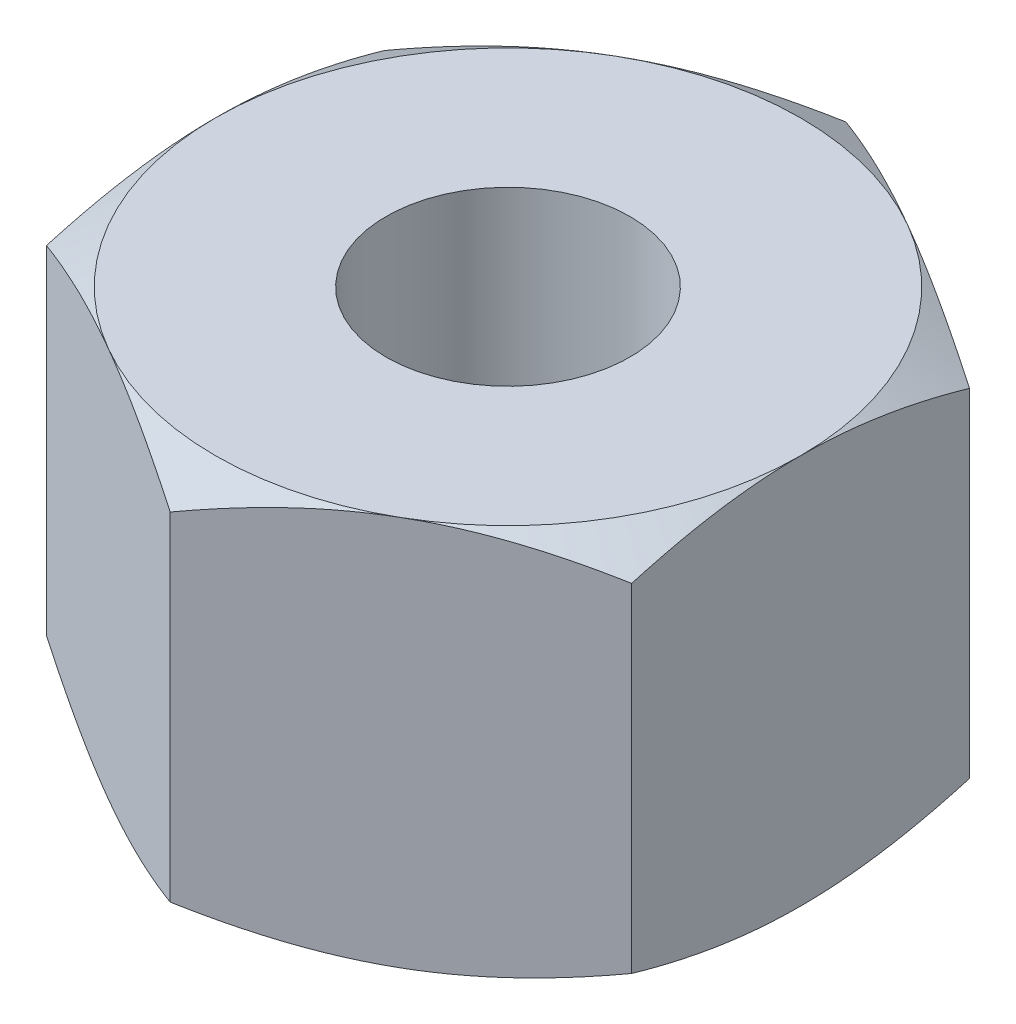
ISO-10303-21;
HEADER;
FILE_DESCRIPTION(('STEP AP214'),'2;1');
FILE_NAME('part.step','',(''),(''),'','','');
FILE_SCHEMA(('AUTOMOTIVE_DESIGN { 1 0 10303 214 1 1 1 1 }'));
ENDSEC;
DATA;
#1=APPLICATION_CONTEXT('core data for automotive mechanical design processes');
#2=APPLICATION_PROTOCOL_DEFINITION('international standard','automotive_design',2000,#1);
#3=PRODUCT_CONTEXT('',#1,'mechanical');
#4=PRODUCT('Part','Part','',(#3));
#5=PRODUCT_RELATED_PRODUCT_CATEGORY('part','',(#4));
#6=PRODUCT_DEFINITION_FORMATION('','',#4);
#7=PRODUCT_DEFINITION_CONTEXT('part definition',#1,'design');
#8=PRODUCT_DEFINITION('design','',#6,#7);
#9=PRODUCT_DEFINITION_SHAPE('','',#8);
#10=(LENGTH_UNIT() NAMED_UNIT(*) SI_UNIT(.MILLI.,.METRE.));
#11=(NAMED_UNIT(*) PLANE_ANGLE_UNIT() SI_UNIT($,.RADIAN.));
#12=(NAMED_UNIT(*) SI_UNIT($,.STERADIAN.) SOLID_ANGLE_UNIT());
#13=UNCERTAINTY_MEASURE_WITH_UNIT(LENGTH_MEASURE(1.E-05),#10,'distance_accuracy_value','');
#14=(GEOMETRIC_REPRESENTATION_CONTEXT(3) GLOBAL_UNCERTAINTY_ASSIGNED_CONTEXT((#13)) GLOBAL_UNIT_ASSIGNED_CONTEXT((#10,
#11,#12)) REPRESENTATION_CONTEXT('',''));
#15=CARTESIAN_POINT('',(0.,0.,0.));
#16=DIRECTION('',(0.,0.,1.));
#17=DIRECTION('',(1.,0.,0.));
#18=AXIS2_PLACEMENT_3D('',#15,#16,#17);
#19=CARTESIAN_POINT('',(1.5,2.,-0.86602540378444));
#20=DIRECTION('',(-0.5,0.,0.866025403784439));
#21=DIRECTION('',(0.866025403784439,0.,0.5));
#22=AXIS2_PLACEMENT_3D('',#19,#20,#21);
#23=PLANE('',#22);
#24=CARTESIAN_POINT('',(-0.000200000000000435,0.134041269548449,-1.73216627762271));
#25=CARTESIAN_POINT('',(0.0657192911025472,0.112057452769177,-1.69410775715987));
#26=CARTESIAN_POINT('',(0.132207589122234,0.0920634856818216,-1.65572072040024));
#27=CARTESIAN_POINT('',(0.26633566066507,0.057162697184506,-1.5782818421891));
#28=CARTESIAN_POINT('',(0.333977818646886,0.0422682243231661,-1.53922862406973));
#29=CARTESIAN_POINT('',(0.468423777869843,0.0190812773102424,-1.4616062133209));
#30=CARTESIAN_POINT('',(0.535206884927247,0.0106345077118139,-1.42304896848399));
#31=CARTESIAN_POINT('',(0.66908756838988,0.000548173511852322,-1.34575291984755));
#32=CARTESIAN_POINT('',(0.736184657704378,-0.00109974064210989,-1.30701439726998));
#33=CARTESIAN_POINT('',(0.861574731829195,0.0023162190531039,-1.23462040422031));
#34=CARTESIAN_POINT('',(0.919886423219819,0.00654135522397954,-1.20095413349903));
#35=CARTESIAN_POINT('',(1.03612987953878,0.0199363714326705,-1.13384094270175));
#36=CARTESIAN_POINT('',(1.09406124196878,0.0291108336158475,-1.10039425500826));
#37=CARTESIAN_POINT('',(1.21054465133915,0.0520477799549937,-1.03314252725216));
#38=CARTESIAN_POINT('',(1.26908194454669,0.0659075581614449,-0.999346005261152));
#39=CARTESIAN_POINT('',(1.38528312338636,0.0973643802366543,-0.932257223377918));
#40=CARTESIAN_POINT('',(1.44294849940381,0.114954025889614,-0.898964103011322));
#41=CARTESIAN_POINT('',(1.5002,0.134041269548449,-0.865909933730602));
#42=B_SPLINE_CURVE_WITH_KNOTS('',3,(#24,#25,#26,#27,#28,#29,#30,#31,#32,#33,#34,#35,#36,#37,#38,
#39,#40,#41),.UNSPECIFIED.,.F.,.F.,(4,2,2,2,2,2,2,2,4),(0.,0.237777822177383,0.476127422841919,
0.70857706723059,0.94074115925158,1.1429435283589,1.34533342091875,1.55221450553907,
1.75868901573748),.UNSPECIFIED.);
#43=CARTESIAN_POINT('',(0.,0.13397459621556,-1.73205080756888));
#44=VERTEX_POINT('',#43);
#45=CARTESIAN_POINT('',(0.75,0.,-1.29903810567666));
#46=VERTEX_POINT('',#45);
#47=EDGE_CURVE('E53',#44,#46,#42,.T.);
#48=ORIENTED_EDGE('',*,*,#47,.F.);
#49=DIRECTION('',(0.,-1.,0.));
#50=VECTOR('',#49,1.);
#51=CARTESIAN_POINT('',(0.,2.,-1.73205080756888));
#52=LINE('',#51,#50);
#53=CARTESIAN_POINT('',(0.,1.86602540378444,-1.73205080756888));
#54=VERTEX_POINT('',#53);
#55=EDGE_CURVE('E279',#54,#44,#52,.T.);
#56=ORIENTED_EDGE('',*,*,#55,.F.);
#57=CARTESIAN_POINT('',(1.5002,1.86595873045155,-0.865909933730602));
#58=CARTESIAN_POINT('',(1.43428070889745,1.88794254723082,-0.903968454193447));
#59=CARTESIAN_POINT('',(1.36779241087776,1.90793651431818,-0.942355490953073));
#60=CARTESIAN_POINT('',(1.23366433933493,1.94283730281549,-1.01979436916421));
#61=CARTESIAN_POINT('',(1.16602218135311,1.95773177567683,-1.05884758728358));
#62=CARTESIAN_POINT('',(1.03157622213016,1.98091872268976,-1.13646999803241));
#63=CARTESIAN_POINT('',(0.964793115072751,1.98936549228819,-1.17502724286933));
#64=CARTESIAN_POINT('',(0.830912431610118,1.99945182648815,-1.25232329150577));
#65=CARTESIAN_POINT('',(0.76381534229562,2.00109974064211,-1.29106181408333));
#66=CARTESIAN_POINT('',(0.638425268170803,1.9976837809469,-1.363455807133));
#67=CARTESIAN_POINT('',(0.580113576780179,1.99345864477602,-1.39712207785428));
#68=CARTESIAN_POINT('',(0.463870120461216,1.98006362856733,-1.46423526865157));
#69=CARTESIAN_POINT('',(0.405938758031213,1.97088916638415,-1.49768195634505));
#70=CARTESIAN_POINT('',(0.289455348660847,1.94795222004501,-1.56493368410116));
#71=CARTESIAN_POINT('',(0.230918055453307,1.93409244183855,-1.59873020609216));
#72=CARTESIAN_POINT('',(0.114716876613639,1.90263561976335,-1.6658189879754));
#73=CARTESIAN_POINT('',(0.0570515005961887,1.88504597411039,-1.69911210834199));
#74=CARTESIAN_POINT('',(-0.000200000000000495,1.86595873045155,-1.73216627762271));
#75=B_SPLINE_CURVE_WITH_KNOTS('',3,(#57,#58,#59,#60,#61,#62,#63,#64,#65,#66,#67,#68,#69,#70,#71,
#72,#73,#74),.UNSPECIFIED.,.F.,.F.,(4,2,2,2,2,2,2,2,4),(0.,0.237777822177383,0.476127422841918,
0.708577067230589,0.940741159251579,1.1429435283589,1.34533342091875,1.55221450553907,
1.75868901573748),.UNSPECIFIED.);
#76=CARTESIAN_POINT('',(0.749999999999999,2.,-1.29903810567666));
#77=VERTEX_POINT('',#76);
#78=EDGE_CURVE('E251',#77,#54,#75,.T.);
#79=ORIENTED_EDGE('',*,*,#78,.F.);
#80=CARTESIAN_POINT('',(1.5,1.86602540378444,-0.86602540378444));
#81=VERTEX_POINT('',#80);
#82=EDGE_CURVE('E319',#81,#77,#75,.T.);
#83=ORIENTED_EDGE('',*,*,#82,.F.);
#84=DIRECTION('',(0.,-1.,0.));
#85=VECTOR('',#84,1.);
#86=CARTESIAN_POINT('',(1.5,2.,-0.86602540378444));
#87=LINE('',#86,#85);
#88=CARTESIAN_POINT('',(1.5,0.13397459621556,-0.86602540378444));
#89=VERTEX_POINT('',#88);
#90=EDGE_CURVE('E321',#81,#89,#87,.T.);
#91=ORIENTED_EDGE('',*,*,#90,.T.);
#92=EDGE_CURVE('E138',#46,#89,#42,.T.);
#93=ORIENTED_EDGE('',*,*,#92,.F.);
#94=EDGE_LOOP('',(#48,#56,#79,#83,#91,#93));
#95=FACE_BOUND('',#94,.T.);
#96=ADVANCED_FACE('F37',(#95),#23,.F.);
#97=CARTESIAN_POINT('',(0.,2.,-1.73205080756888));
#98=DIRECTION('',(0.5,0.,0.866025403784439));
#99=DIRECTION('',(0.866025403784438,0.,-0.5));
#100=AXIS2_PLACEMENT_3D('',#97,#98,#99);
#101=PLANE('',#100);
#102=CARTESIAN_POINT('',(-1.5002,0.134041269548449,-0.8659099337306));
#103=CARTESIAN_POINT('',(-1.43428070889745,0.112057452769177,-0.903968454193445));
#104=CARTESIAN_POINT('',(-1.36779241087776,0.0920634856818216,-0.942355490953072));
#105=CARTESIAN_POINT('',(-1.23366433933493,0.0571626971845059,-1.01979436916421));
#106=CARTESIAN_POINT('',(-1.16602218135311,0.0422682243231661,-1.05884758728358));
#107=CARTESIAN_POINT('',(-1.03157622213016,0.0190812773102424,-1.13646999803241));
#108=CARTESIAN_POINT('',(-0.964793115072752,0.0106345077118139,-1.17502724286933));
#109=CARTESIAN_POINT('',(-0.83091243161012,0.000548173511852331,-1.25232329150577));
#110=CARTESIAN_POINT('',(-0.763815342295622,-0.00109974064210983,-1.29106181408333));
#111=CARTESIAN_POINT('',(-0.638425268170805,0.00231621905310397,-1.363455807133));
#112=CARTESIAN_POINT('',(-0.580113576780181,0.00654135522397959,-1.39712207785428));
#113=CARTESIAN_POINT('',(-0.463870120461218,0.0199363714326705,-1.46423526865157));
#114=CARTESIAN_POINT('',(-0.405938758031215,0.0291108336158474,-1.49768195634505));
#115=CARTESIAN_POINT('',(-0.289455348660848,0.0520477799549937,-1.56493368410116));
#116=CARTESIAN_POINT('',(-0.230918055453309,0.0659075581614451,-1.59873020609216));
#117=CARTESIAN_POINT('',(-0.114716876613641,0.0973643802366547,-1.6658189879754));
#118=CARTESIAN_POINT('',(-0.05705150059619,0.114954025889614,-1.69911210834199));
#119=CARTESIAN_POINT('',(0.000199999999999477,0.134041269548449,-1.73216627762271));
#120=B_SPLINE_CURVE_WITH_KNOTS('',3,(#102,#103,#104,#105,#106,#107,#108,#109,#110,#111,#112,
#113,#114,#115,#116,#117,#118,#119),.UNSPECIFIED.,.F.,.F.,(4,2,2,2,2,2,2,2,4),(0.,
0.237777822177383,0.476127422841919,0.70857706723059,0.94074115925158,1.1429435283589,
1.34533342091875,1.55221450553907,1.75868901573748),.UNSPECIFIED.);
#121=CARTESIAN_POINT('',(-1.5,0.13397459621556,-0.866025403784438));
#122=VERTEX_POINT('',#121);
#123=CARTESIAN_POINT('',(-0.75,0.,-1.29903810567666));
#124=VERTEX_POINT('',#123);
#125=EDGE_CURVE('E61',#122,#124,#120,.T.);
#126=ORIENTED_EDGE('',*,*,#125,.F.);
#127=DIRECTION('',(0.,-1.,0.));
#128=VECTOR('',#127,1.);
#129=CARTESIAN_POINT('',(-1.5,2.,-0.866025403784438));
#130=LINE('',#129,#128);
#131=CARTESIAN_POINT('',(-1.5,1.86602540378444,-0.866025403784438));
#132=VERTEX_POINT('',#131);
#133=EDGE_CURVE('E272',#132,#122,#130,.T.);
#134=ORIENTED_EDGE('',*,*,#133,.F.);
#135=CARTESIAN_POINT('',(0.000199999999999538,1.86595873045155,-1.73216627762271));
#136=CARTESIAN_POINT('',(-0.065719291102548,1.88794254723082,-1.69410775715987));
#137=CARTESIAN_POINT('',(-0.132207589122235,1.90793651431818,-1.65572072040024));
#138=CARTESIAN_POINT('',(-0.26633566066507,1.94283730281549,-1.5782818421891));
#139=CARTESIAN_POINT('',(-0.333977818646886,1.95773177567683,-1.53922862406973));
#140=CARTESIAN_POINT('',(-0.468423777869843,1.98091872268976,-1.4616062133209));
#141=CARTESIAN_POINT('',(-0.535206884927248,1.98936549228819,-1.42304896848399));
#142=CARTESIAN_POINT('',(-0.669087568389881,1.99945182648815,-1.34575291984755));
#143=CARTESIAN_POINT('',(-0.736184657704379,2.00109974064211,-1.30701439726998));
#144=CARTESIAN_POINT('',(-0.861574731829195,1.9976837809469,-1.23462040422031));
#145=CARTESIAN_POINT('',(-0.919886423219819,1.99345864477602,-1.20095413349903));
#146=CARTESIAN_POINT('',(-1.03612987953878,1.98006362856733,-1.13384094270175));
#147=CARTESIAN_POINT('',(-1.09406124196879,1.97088916638415,-1.10039425500826));
#148=CARTESIAN_POINT('',(-1.21054465133915,1.94795222004501,-1.03314252725216));
#149=CARTESIAN_POINT('',(-1.26908194454669,1.93409244183855,-0.999346005261151));
#150=CARTESIAN_POINT('',(-1.38528312338636,1.90263561976335,-0.932257223377916));
#151=CARTESIAN_POINT('',(-1.44294849940381,1.88504597411039,-0.89896410301132));
#152=CARTESIAN_POINT('',(-1.5002,1.86595873045155,-0.8659099337306));
#153=B_SPLINE_CURVE_WITH_KNOTS('',3,(#135,#136,#137,#138,#139,#140,#141,#142,#143,#144,#145,
#146,#147,#148,#149,#150,#151,#152),.UNSPECIFIED.,.F.,.F.,(4,2,2,2,2,2,2,2,4),(0.,
0.237777822177383,0.476127422841919,0.70857706723059,0.94074115925158,1.1429435283589,
1.34533342091875,1.55221450553907,1.75868901573748),.UNSPECIFIED.);
#154=CARTESIAN_POINT('',(-0.75,2.,-1.29903810567666));
#155=VERTEX_POINT('',#154);
#156=EDGE_CURVE('E244',#155,#132,#153,.T.);
#157=ORIENTED_EDGE('',*,*,#156,.F.);
#158=EDGE_CURVE('E250',#54,#155,#153,.T.);
#159=ORIENTED_EDGE('',*,*,#158,.F.);
#160=ORIENTED_EDGE('',*,*,#55,.T.);
#161=EDGE_CURVE('E161',#124,#44,#120,.T.);
#162=ORIENTED_EDGE('',*,*,#161,.F.);
#163=EDGE_LOOP('',(#126,#134,#157,#159,#160,#162));
#164=FACE_BOUND('',#163,.T.);
#165=ADVANCED_FACE('F257',(#164),#101,.F.);
#166=CARTESIAN_POINT('',(-1.5,2.,-0.866025403784438));
#167=DIRECTION('',(1.,0.,0.));
#168=DIRECTION('',(0.,0.,-1.));
#169=AXIS2_PLACEMENT_3D('',#166,#167,#168);
#170=PLANE('',#169);
#171=CARTESIAN_POINT('',(-1.5,1.23935326559912,3.32383182855059));
#172=CARTESIAN_POINT('',(-1.5,1.19931072203002,3.24773444081221));
#173=CARTESIAN_POINT('',(-1.5,1.15944483419007,3.17154359329883));
#174=CARTESIAN_POINT('',(-1.5,1.08015344998119,3.01893211735204));
#175=CARTESIAN_POINT('',(-1.5,1.0407279585016,2.94251148637947));
#176=CARTESIAN_POINT('',(-1.5,0.923140733543339,2.71264122693784));
#177=CARTESIAN_POINT('',(-1.5,0.845774334636883,2.55878373390948));
#178=CARTESIAN_POINT('',(-1.5,0.689886007328986,2.24057476050208));
#179=CARTESIAN_POINT('',(-1.5,0.611553856504214,2.07612896534836));
#180=CARTESIAN_POINT('',(-1.5,0.498633815715322,1.82741823782556));
#181=CARTESIAN_POINT('',(-1.5,0.461764449151681,1.74419287639866));
#182=CARTESIAN_POINT('',(-1.5,0.390073652916677,1.57686805200305));
#183=CARTESIAN_POINT('',(-1.5,0.355252050088427,1.4927686636509));
#184=CARTESIAN_POINT('',(-1.5,0.285008495735525,1.31501031190938));
#185=CARTESIAN_POINT('',(-1.5,0.249874575221898,1.22123621362942));
#186=CARTESIAN_POINT('',(-1.5,0.184287701993703,1.0320807610056));
#187=CARTESIAN_POINT('',(-1.5,0.153832802613613,0.936700093487788));
#188=CARTESIAN_POINT('',(-1.5,0.100039738372326,0.746059020269428));
#189=CARTESIAN_POINT('',(-1.5,0.0765660130122355,0.650837846261879));
#190=CARTESIAN_POINT('',(-1.5,0.0380966740241617,0.458690084648549));
#191=CARTESIAN_POINT('',(-1.5,0.0230963320255924,0.361764479360881));
#192=CARTESIAN_POINT('',(-1.5,0.00337847888060209,0.164770618469119));
#193=CARTESIAN_POINT('',(-1.5,-0.00111767148941501,0.0646790110011701));
#194=CARTESIAN_POINT('',(-1.5,0.00159794329697957,-0.135331842199714));
#195=CARTESIAN_POINT('',(-1.5,0.0088093013864336,-0.235251093804494));
#196=CARTESIAN_POINT('',(-1.5,0.0340082058069467,-0.435926448061239));
#197=CARTESIAN_POINT('',(-1.5,0.0522330587510966,-0.536651321222842));
#198=CARTESIAN_POINT('',(-1.5,0.097214063241731,-0.736181517411992));
#199=CARTESIAN_POINT('',(-1.5,0.123976558557891,-0.834985354940177));
#200=CARTESIAN_POINT('',(-1.5,0.186883165276771,-1.04132362943054));
#201=CARTESIAN_POINT('',(-1.5,0.223731149959186,-1.14863854017299));
#202=CARTESIAN_POINT('',(-1.5,0.302553492065502,-1.36138875191757));
#203=CARTESIAN_POINT('',(-1.5,0.344530313552321,-1.4668231213491));
#204=CARTESIAN_POINT('',(-1.5,0.432057731625892,-1.67639285335309));
#205=CARTESIAN_POINT('',(-1.5,0.477614267398377,-1.78052571011326));
#206=CARTESIAN_POINT('',(-1.5,0.571185850553668,-1.98768283112336));
#207=CARTESIAN_POINT('',(-1.5,0.619201093337546,-2.0907070064731));
#208=CARTESIAN_POINT('',(-1.5,0.713627146492178,-2.28884408430459));
#209=CARTESIAN_POINT('',(-1.5,0.759920677438779,-2.38401313856044));
#210=CARTESIAN_POINT('',(-1.5,0.85366156162985,-2.57378692277396));
#211=CARTESIAN_POINT('',(-1.5,0.90110898294307,-2.66839161902783));
#212=CARTESIAN_POINT('',(-1.5,0.996640526958966,-2.85667408411614));
#213=CARTESIAN_POINT('',(-1.5,1.04472019167893,-2.95035412036296));
#214=CARTESIAN_POINT('',(-1.5,1.14156566427049,-3.13734549738905));
#215=CARTESIAN_POINT('',(-1.5,1.19033139277256,-3.23065687924335));
#216=CARTESIAN_POINT('',(-1.5,1.23935326559912,-3.32383182855059));
#217=B_SPLINE_CURVE_WITH_KNOTS('',3,(#171,#172,#173,#174,#175,#176,#177,#178,#179,#180,#181,
#182,#183,#184,#185,#186,#187,#188,#189,#190,#191,#192,#193,#194,#195,#196,#197,#198,#199,#200,
#201,#202,#203,#204,#205,#206,#207,#208,#209,#210,#211,#212,#213,#214,#215,#216),.UNSPECIFIED.,
.F.,.F.,(4,2,2,2,2,2,2,2,2,2,2,2,2,2,2,2,2,2,2,2,2,2,4),(0.,0.257969275327055,0.515941411825195,
1.03256613880967,1.57892532486768,1.85198467157293,2.12502089534906,2.42535429882314,
2.72556241088318,3.019489815213,3.31325303788595,3.61315314686089,3.91304282861206,
4.21963679585738,4.52645910593605,4.86665962067304,5.20702422645939,5.54796597217963,
5.88893485577818,6.20641871472018,6.52392134789196,6.83981132523501,7.15566505352143),.UNSPECIFIED.);
#218=CARTESIAN_POINT('',(-1.5,0.13397459621556,0.866025403784439));
#219=VERTEX_POINT('',#218);
#220=CARTESIAN_POINT('',(-1.5,0.,0.));
#221=VERTEX_POINT('',#220);
#222=EDGE_CURVE('E348',#219,#221,#217,.T.);
#223=ORIENTED_EDGE('',*,*,#222,.F.);
#224=DIRECTION('',(0.,-1.,0.));
#225=VECTOR('',#224,1.);
#226=CARTESIAN_POINT('',(-1.5,2.,0.866025403784439));
#227=LINE('',#226,#225);
#228=CARTESIAN_POINT('',(-1.5,1.86602540378444,0.866025403784439));
#229=VERTEX_POINT('',#228);
#230=EDGE_CURVE('E280',#229,#219,#227,.T.);
#231=ORIENTED_EDGE('',*,*,#230,.F.);
#232=CARTESIAN_POINT('',(-1.5,0.760646734400879,-3.32383182855059));
#233=CARTESIAN_POINT('',(-1.5,0.800689277969975,-3.24773444081221));
#234=CARTESIAN_POINT('',(-1.5,0.840555165809925,-3.17154359329883));
#235=CARTESIAN_POINT('',(-1.5,0.91984655001881,-3.01893211735204));
#236=CARTESIAN_POINT('',(-1.5,0.959272041498401,-2.94251148637947));
#237=CARTESIAN_POINT('',(-1.5,1.07685926645666,-2.71264122693784));
#238=CARTESIAN_POINT('',(-1.5,1.15422566536312,-2.55878373390948));
#239=CARTESIAN_POINT('',(-1.5,1.31011399267101,-2.24057476050208));
#240=CARTESIAN_POINT('',(-1.5,1.38844614349579,-2.07612896534836));
#241=CARTESIAN_POINT('',(-1.5,1.50136618428468,-1.82741823782556));
#242=CARTESIAN_POINT('',(-1.5,1.53823555084832,-1.74419287639866));
#243=CARTESIAN_POINT('',(-1.5,1.60992634708332,-1.57686805200305));
#244=CARTESIAN_POINT('',(-1.5,1.64474794991157,-1.4927686636509));
#245=CARTESIAN_POINT('',(-1.5,1.71499150426447,-1.31501031190938));
#246=CARTESIAN_POINT('',(-1.5,1.7501254247781,-1.22123621362942));
#247=CARTESIAN_POINT('',(-1.5,1.8157122980063,-1.0320807610056));
#248=CARTESIAN_POINT('',(-1.5,1.84616719738639,-0.936700093487788));
#249=CARTESIAN_POINT('',(-1.5,1.89996026162767,-0.746059020269428));
#250=CARTESIAN_POINT('',(-1.5,1.92343398698776,-0.650837846261879));
#251=CARTESIAN_POINT('',(-1.5,1.96190332597584,-0.458690084648549));
#252=CARTESIAN_POINT('',(-1.5,1.97690366797441,-0.36176447936088));
#253=CARTESIAN_POINT('',(-1.5,1.9966215211194,-0.164770618469118));
#254=CARTESIAN_POINT('',(-1.5,2.00111767148941,-0.0646790110011692));
#255=CARTESIAN_POINT('',(-1.5,1.99840205670302,0.135331842199715));
#256=CARTESIAN_POINT('',(-1.5,1.99119069861357,0.235251093804495));
#257=CARTESIAN_POINT('',(-1.5,1.96599179419305,0.43592644806124));
#258=CARTESIAN_POINT('',(-1.5,1.9477669412489,0.536651321222843));
#259=CARTESIAN_POINT('',(-1.5,1.90278593675827,0.736181517411994));
#260=CARTESIAN_POINT('',(-1.5,1.87602344144211,0.834985354940178));
#261=CARTESIAN_POINT('',(-1.5,1.81311683472323,1.04132362943054));
#262=CARTESIAN_POINT('',(-1.5,1.77626885004081,1.14863854017299));
#263=CARTESIAN_POINT('',(-1.5,1.6974465079345,1.36138875191757));
#264=CARTESIAN_POINT('',(-1.5,1.65546968644768,1.46682312134911));
#265=CARTESIAN_POINT('',(-1.5,1.56794226837411,1.6763928533531));
#266=CARTESIAN_POINT('',(-1.5,1.52238573260162,1.78052571011326));
#267=CARTESIAN_POINT('',(-1.5,1.42881414944633,1.98768283112336));
#268=CARTESIAN_POINT('',(-1.5,1.38079890666245,2.0907070064731));
#269=CARTESIAN_POINT('',(-1.5,1.28637285350782,2.28884408430459));
#270=CARTESIAN_POINT('',(-1.5,1.24007932256122,2.38401313856044));
#271=CARTESIAN_POINT('',(-1.5,1.14633843837015,2.57378692277396));
#272=CARTESIAN_POINT('',(-1.5,1.09889101705693,2.66839161902783));
#273=CARTESIAN_POINT('',(-1.5,1.00335947304103,2.85667408411614));
#274=CARTESIAN_POINT('',(-1.5,0.955279808321074,2.95035412036296));
#275=CARTESIAN_POINT('',(-1.5,0.858434335729514,3.13734549738905));
#276=CARTESIAN_POINT('',(-1.5,0.809668607227437,3.23065687924335));
#277=CARTESIAN_POINT('',(-1.5,0.76064673440088,3.32383182855059));
#278=B_SPLINE_CURVE_WITH_KNOTS('',3,(#232,#233,#234,#235,#236,#237,#238,#239,#240,#241,#242,
#243,#244,#245,#246,#247,#248,#249,#250,#251,#252,#253,#254,#255,#256,#257,#258,#259,#260,#261,
#262,#263,#264,#265,#266,#267,#268,#269,#270,#271,#272,#273,#274,#275,#276,#277),.UNSPECIFIED.,
.F.,.F.,(4,2,2,2,2,2,2,2,2,2,2,2,2,2,2,2,2,2,2,2,2,2,4),(0.,0.257969275327055,0.515941411825195,
1.03256613880967,1.57892532486768,1.85198467157293,2.12502089534906,2.42535429882314,
2.72556241088318,3.019489815213,3.31325303788595,3.61315314686089,3.91304282861206,
4.21963679585738,4.52645910593605,4.86665962067304,5.20702422645939,5.54796597217963,
5.88893485577818,6.20641871472017,6.52392134789196,6.83981132523501,7.15566505352143),.UNSPECIFIED.);
#279=CARTESIAN_POINT('',(-1.5,2.,0.));
#280=VERTEX_POINT('',#279);
#281=EDGE_CURVE('E237',#280,#229,#278,.T.);
#282=ORIENTED_EDGE('',*,*,#281,.F.);
#283=EDGE_CURVE('E243',#132,#280,#278,.T.);
#284=ORIENTED_EDGE('',*,*,#283,.F.);
#285=ORIENTED_EDGE('',*,*,#133,.T.);
#286=EDGE_CURVE('E196',#221,#122,#217,.T.);
#287=ORIENTED_EDGE('',*,*,#286,.F.);
#288=EDGE_LOOP('',(#223,#231,#282,#284,#285,#287));
#289=FACE_BOUND('',#288,.T.);
#290=ADVANCED_FACE('F218',(#289),#170,.F.);
#291=CARTESIAN_POINT('',(-1.5,2.,0.866025403784439));
#292=DIRECTION('',(0.5,0.,-0.866025403784439));
#293=DIRECTION('',(-0.866025403784439,0.,-0.5));
#294=AXIS2_PLACEMENT_3D('',#291,#292,#293);
#295=PLANE('',#294);
#296=CARTESIAN_POINT('',(0.000200000000000532,0.134041269548449,1.73216627762271));
#297=CARTESIAN_POINT('',(-0.0657192911025471,0.112057452769177,1.69410775715987));
#298=CARTESIAN_POINT('',(-0.132207589122234,0.0920634856818218,1.65572072040024));
#299=CARTESIAN_POINT('',(-0.266335660665069,0.057162697184506,1.5782818421891));
#300=CARTESIAN_POINT('',(-0.333977818646885,0.0422682243231661,1.53922862406973));
#301=CARTESIAN_POINT('',(-0.468423777869842,0.0190812773102423,1.4616062133209));
#302=CARTESIAN_POINT('',(-0.535206884927247,0.0106345077118138,1.42304896848399));
#303=CARTESIAN_POINT('',(-0.66908756838988,0.000548173511852292,1.34575291984755));
#304=CARTESIAN_POINT('',(-0.736184657704378,-0.00109974064210984,1.30701439726998));
#305=CARTESIAN_POINT('',(-0.861574731829195,0.00231621905310392,1.23462040422031));
#306=CARTESIAN_POINT('',(-0.919886423219819,0.00654135522397948,1.20095413349903));
#307=CARTESIAN_POINT('',(-1.03612987953878,0.0199363714326704,1.13384094270175));
#308=CARTESIAN_POINT('',(-1.09406124196879,0.0291108336158474,1.10039425500826));
#309=CARTESIAN_POINT('',(-1.21054465133915,0.0520477799549938,1.03314252725216));
#310=CARTESIAN_POINT('',(-1.26908194454669,0.065907558161445,0.999346005261151));
#311=CARTESIAN_POINT('',(-1.38528312338636,0.0973643802366546,0.932257223377917));
#312=CARTESIAN_POINT('',(-1.44294849940381,0.114954025889614,0.898964103011321));
#313=CARTESIAN_POINT('',(-1.5002,0.134041269548449,0.865909933730601));
#314=B_SPLINE_CURVE_WITH_KNOTS('',3,(#296,#297,#298,#299,#300,#301,#302,#303,#304,#305,#306,
#307,#308,#309,#310,#311,#312,#313),.UNSPECIFIED.,.F.,.F.,(4,2,2,2,2,2,2,2,4),(0.,
0.237777822177383,0.476127422841918,0.708577067230589,0.94074115925158,1.1429435283589,
1.34533342091875,1.55221450553907,1.75868901573748),.UNSPECIFIED.);
#315=CARTESIAN_POINT('',(0.,0.13397459621556,1.73205080756888));
#316=VERTEX_POINT('',#315);
#317=CARTESIAN_POINT('',(-0.75,0.,1.29903810567666));
#318=VERTEX_POINT('',#317);
#319=EDGE_CURVE('E147',#316,#318,#314,.T.);
#320=ORIENTED_EDGE('',*,*,#319,.F.);
#321=DIRECTION('',(0.,-1.,0.));
#322=VECTOR('',#321,1.);
#323=CARTESIAN_POINT('',(0.,2.,1.73205080756888));
#324=LINE('',#323,#322);
#325=CARTESIAN_POINT('',(0.,1.86602540378444,1.73205080756888));
#326=VERTEX_POINT('',#325);
#327=EDGE_CURVE('E160',#326,#316,#324,.T.);
#328=ORIENTED_EDGE('',*,*,#327,.F.);
#329=CARTESIAN_POINT('',(-1.5002,1.86595873045155,0.865909933730601));
#330=CARTESIAN_POINT('',(-1.43428070889745,1.88794254723082,0.903968454193446));
#331=CARTESIAN_POINT('',(-1.36779241087776,1.90793651431818,0.942355490953072));
#332=CARTESIAN_POINT('',(-1.23366433933493,1.94283730281549,1.01979436916421));
#333=CARTESIAN_POINT('',(-1.16602218135311,1.95773177567683,1.05884758728358));
#334=CARTESIAN_POINT('',(-1.03157622213016,1.98091872268976,1.13646999803241));
#335=CARTESIAN_POINT('',(-0.964793115072751,1.98936549228819,1.17502724286933));
#336=CARTESIAN_POINT('',(-0.830912431610119,1.99945182648815,1.25232329150577));
#337=CARTESIAN_POINT('',(-0.763815342295621,2.00109974064211,1.29106181408333));
#338=CARTESIAN_POINT('',(-0.638425268170804,1.9976837809469,1.363455807133));
#339=CARTESIAN_POINT('',(-0.58011357678018,1.99345864477602,1.39712207785428));
#340=CARTESIAN_POINT('',(-0.463870120461217,1.98006362856733,1.46423526865157));
#341=CARTESIAN_POINT('',(-0.405938758031214,1.97088916638415,1.49768195634505));
#342=CARTESIAN_POINT('',(-0.289455348660847,1.94795222004501,1.56493368410116));
#343=CARTESIAN_POINT('',(-0.230918055453307,1.93409244183855,1.59873020609216));
#344=CARTESIAN_POINT('',(-0.114716876613639,1.90263561976335,1.6658189879754));
#345=CARTESIAN_POINT('',(-0.0570515005961885,1.88504597411039,1.69911210834199));
#346=CARTESIAN_POINT('',(0.000200000000000723,1.86595873045155,1.73216627762271));
#347=B_SPLINE_CURVE_WITH_KNOTS('',3,(#329,#330,#331,#332,#333,#334,#335,#336,#337,#338,#339,
#340,#341,#342,#343,#344,#345,#346),.UNSPECIFIED.,.F.,.F.,(4,2,2,2,2,2,2,2,4),(0.,
0.237777822177383,0.476127422841919,0.70857706723059,0.94074115925158,1.1429435283589,
1.34533342091875,1.55221450553907,1.75868901573748),.UNSPECIFIED.);
#348=CARTESIAN_POINT('',(-0.749999999999999,2.,1.29903810567666));
#349=VERTEX_POINT('',#348);
#350=EDGE_CURVE('E223',#349,#326,#347,.T.);
#351=ORIENTED_EDGE('',*,*,#350,.F.);
#352=EDGE_CURVE('E230',#229,#349,#347,.T.);
#353=ORIENTED_EDGE('',*,*,#352,.F.);
#354=ORIENTED_EDGE('',*,*,#230,.T.);
#355=EDGE_CURVE('E163',#318,#219,#314,.T.);
#356=ORIENTED_EDGE('',*,*,#355,.F.);
#357=EDGE_LOOP('',(#320,#328,#351,#353,#354,#356));
#358=FACE_BOUND('',#357,.T.);
#359=ADVANCED_FACE('F215',(#358),#295,.F.);
#360=CARTESIAN_POINT('',(0.,2.,1.73205080756888));
#361=DIRECTION('',(-0.5,0.,-0.866025403784439));
#362=DIRECTION('',(-0.866025403784439,0.,0.5));
#363=AXIS2_PLACEMENT_3D('',#360,#361,#362);
#364=PLANE('',#363);
#365=CARTESIAN_POINT('',(1.5002,0.134041269548449,0.865909933730602));
#366=CARTESIAN_POINT('',(1.43428070889745,0.112057452769177,0.903968454193447));
#367=CARTESIAN_POINT('',(1.36779241087776,0.0920634856818217,0.942355490953073));
#368=CARTESIAN_POINT('',(1.23366433933493,0.057162697184506,1.01979436916421));
#369=CARTESIAN_POINT('',(1.16602218135311,0.0422682243231661,1.05884758728358));
#370=CARTESIAN_POINT('',(1.03157622213016,0.0190812773102425,1.13646999803241));
#371=CARTESIAN_POINT('',(0.964793115072751,0.0106345077118142,1.17502724286933));
#372=CARTESIAN_POINT('',(0.830912431610119,0.000548173511852633,1.25232329150577));
#373=CARTESIAN_POINT('',(0.763815342295621,-0.00109974064210963,1.29106181408333));
#374=CARTESIAN_POINT('',(0.638425268170804,0.00231621905310414,1.363455807133));
#375=CARTESIAN_POINT('',(0.58011357678018,0.0065413552239798,1.39712207785428));
#376=CARTESIAN_POINT('',(0.463870120461217,0.0199363714326709,1.46423526865157));
#377=CARTESIAN_POINT('',(0.405938758031214,0.0291108336158478,1.49768195634505));
#378=CARTESIAN_POINT('',(0.289455348660848,0.0520477799549941,1.56493368410116));
#379=CARTESIAN_POINT('',(0.230918055453308,0.0659075581614452,1.59873020609216));
#380=CARTESIAN_POINT('',(0.114716876613641,0.0973643802366547,1.6658189879754));
#381=CARTESIAN_POINT('',(0.05705150059619,0.114954025889614,1.69911210834199));
#382=CARTESIAN_POINT('',(-0.000199999999999293,0.134041269548449,1.73216627762271));
#383=B_SPLINE_CURVE_WITH_KNOTS('',3,(#365,#366,#367,#368,#369,#370,#371,#372,#373,#374,#375,
#376,#377,#378,#379,#380,#381,#382),.UNSPECIFIED.,.F.,.F.,(4,2,2,2,2,2,2,2,4),(0.,
0.237777822177383,0.476127422841919,0.70857706723059,0.94074115925158,1.1429435283589,
1.34533342091875,1.55221450553907,1.75868901573748),.UNSPECIFIED.);
#384=CARTESIAN_POINT('',(1.5,0.13397459621556,0.866025403784439));
#385=VERTEX_POINT('',#384);
#386=CARTESIAN_POINT('',(0.75,0.,1.29903810567666));
#387=VERTEX_POINT('',#386);
#388=EDGE_CURVE('E127',#385,#387,#383,.T.);
#389=ORIENTED_EDGE('',*,*,#388,.F.);
#390=DIRECTION('',(0.,-1.,0.));
#391=VECTOR('',#390,1.);
#392=CARTESIAN_POINT('',(1.5,2.,0.866025403784439));
#393=LINE('',#392,#391);
#394=CARTESIAN_POINT('',(1.5,1.86602540378444,0.866025403784439));
#395=VERTEX_POINT('',#394);
#396=EDGE_CURVE('E326',#395,#385,#393,.T.);
#397=ORIENTED_EDGE('',*,*,#396,.F.);
#398=CARTESIAN_POINT('',(-0.000199999999999442,1.86595873045155,1.73216627762271));
#399=CARTESIAN_POINT('',(0.0657192911025482,1.88794254723082,1.69410775715987));
#400=CARTESIAN_POINT('',(0.132207589122235,1.90793651431818,1.65572072040024));
#401=CARTESIAN_POINT('',(0.266335660665071,1.94283730281549,1.5782818421891));
#402=CARTESIAN_POINT('',(0.333977818646887,1.95773177567683,1.53922862406973));
#403=CARTESIAN_POINT('',(0.468423777869844,1.98091872268976,1.4616062133209));
#404=CARTESIAN_POINT('',(0.535206884927248,1.98936549228819,1.42304896848399));
#405=CARTESIAN_POINT('',(0.669087568389881,1.99945182648815,1.34575291984755));
#406=CARTESIAN_POINT('',(0.736184657704379,2.00109974064211,1.30701439726998));
#407=CARTESIAN_POINT('',(0.861574731829196,1.9976837809469,1.23462040422031));
#408=CARTESIAN_POINT('',(0.91988642321982,1.99345864477602,1.20095413349903));
#409=CARTESIAN_POINT('',(1.03612987953878,1.98006362856733,1.13384094270175));
#410=CARTESIAN_POINT('',(1.09406124196879,1.97088916638415,1.10039425500826));
#411=CARTESIAN_POINT('',(1.21054465133915,1.94795222004501,1.03314252725216));
#412=CARTESIAN_POINT('',(1.26908194454669,1.93409244183855,0.999346005261151));
#413=CARTESIAN_POINT('',(1.38528312338636,1.90263561976335,0.932257223377917));
#414=CARTESIAN_POINT('',(1.44294849940381,1.88504597411039,0.898964103011321));
#415=CARTESIAN_POINT('',(1.5002,1.86595873045155,0.865909933730602));
#416=B_SPLINE_CURVE_WITH_KNOTS('',3,(#398,#399,#400,#401,#402,#403,#404,#405,#406,#407,#408,
#409,#410,#411,#412,#413,#414,#415),.UNSPECIFIED.,.F.,.F.,(4,2,2,2,2,2,2,2,4),(0.,
0.237777822177383,0.476127422841919,0.70857706723059,0.94074115925158,1.1429435283589,
1.34533342091875,1.55221450553907,1.75868901573748),.UNSPECIFIED.);
#417=CARTESIAN_POINT('',(0.75,2.,1.29903810567666));
#418=VERTEX_POINT('',#417);
#419=EDGE_CURVE('E232',#418,#395,#416,.T.);
#420=ORIENTED_EDGE('',*,*,#419,.F.);
#421=EDGE_CURVE('E231',#326,#418,#416,.T.);
#422=ORIENTED_EDGE('',*,*,#421,.F.);
#423=ORIENTED_EDGE('',*,*,#327,.T.);
#424=EDGE_CURVE('E141',#387,#316,#383,.T.);
#425=ORIENTED_EDGE('',*,*,#424,.F.);
#426=EDGE_LOOP('',(#389,#397,#420,#422,#423,#425));
#427=FACE_BOUND('',#426,.T.);
#428=ADVANCED_FACE('F157',(#427),#364,.F.);
#429=CARTESIAN_POINT('',(1.5,2.,0.866025403784439));
#430=DIRECTION('',(-1.,0.,0.));
#431=DIRECTION('',(0.,0.,1.));
#432=AXIS2_PLACEMENT_3D('',#429,#430,#431);
#433=PLANE('',#432);
#434=CARTESIAN_POINT('',(1.5,1.23935326559912,-3.32383182855059));
#435=CARTESIAN_POINT('',(1.5,1.19931072203003,-3.24773444081221));
#436=CARTESIAN_POINT('',(1.5,1.15944483419008,-3.17154359329883));
#437=CARTESIAN_POINT('',(1.5,1.08015344998119,-3.01893211735204));
#438=CARTESIAN_POINT('',(1.5,1.0407279585016,-2.94251148637947));
#439=CARTESIAN_POINT('',(1.5,0.923140733543339,-2.71264122693784));
#440=CARTESIAN_POINT('',(1.5,0.845774334636884,-2.55878373390949));
#441=CARTESIAN_POINT('',(1.5,0.689886007328987,-2.24057476050208));
#442=CARTESIAN_POINT('',(1.5,0.611553856504214,-2.07612896534837));
#443=CARTESIAN_POINT('',(1.5,0.498633815715322,-1.82741823782556));
#444=CARTESIAN_POINT('',(1.5,0.461764449151681,-1.74419287639866));
#445=CARTESIAN_POINT('',(1.5,0.390073652916678,-1.57686805200305));
#446=CARTESIAN_POINT('',(1.5,0.355252050088427,-1.4927686636509));
#447=CARTESIAN_POINT('',(1.5,0.285008495735525,-1.31501031190938));
#448=CARTESIAN_POINT('',(1.5,0.249874575221898,-1.22123621362942));
#449=CARTESIAN_POINT('',(1.5,0.184287701993704,-1.0320807610056));
#450=CARTESIAN_POINT('',(1.5,0.153832802613613,-0.936700093487791));
#451=CARTESIAN_POINT('',(1.5,0.100039738372326,-0.746059020269431));
#452=CARTESIAN_POINT('',(1.5,0.0765660130122357,-0.650837846261881));
#453=CARTESIAN_POINT('',(1.5,0.0380966740241616,-0.458690084648551));
#454=CARTESIAN_POINT('',(1.5,0.0230963320255922,-0.361764479360883));
#455=CARTESIAN_POINT('',(1.5,0.0033784788806018,-0.164770618469121));
#456=CARTESIAN_POINT('',(1.5,-0.00111767148941538,-0.0646790110011719));
#457=CARTESIAN_POINT('',(1.5,0.00159794329697907,0.135331842199712));
#458=CARTESIAN_POINT('',(1.5,0.008809301386433,0.235251093804492));
#459=CARTESIAN_POINT('',(1.5,0.0340082058069459,0.435926448061237));
#460=CARTESIAN_POINT('',(1.5,0.0522330587510959,0.53665132122284));
#461=CARTESIAN_POINT('',(1.5,0.0972140632417302,0.736181517411991));
#462=CARTESIAN_POINT('',(1.5,0.123976558557891,0.834985354940176));
#463=CARTESIAN_POINT('',(1.5,0.18688316527677,1.04132362943054));
#464=CARTESIAN_POINT('',(1.5,0.223731149959185,1.14863854017299));
#465=CARTESIAN_POINT('',(1.5,0.302553492065502,1.36138875191757));
#466=CARTESIAN_POINT('',(1.5,0.344530313552321,1.4668231213491));
#467=CARTESIAN_POINT('',(1.5,0.432057731625892,1.6763928533531));
#468=CARTESIAN_POINT('',(1.5,0.477614267398377,1.78052571011326));
#469=CARTESIAN_POINT('',(1.5,0.571185850553668,1.98768283112336));
#470=CARTESIAN_POINT('',(1.5,0.619201093337546,2.0907070064731));
#471=CARTESIAN_POINT('',(1.5,0.713627146492179,2.28884408430459));
#472=CARTESIAN_POINT('',(1.5,0.75992067743878,2.38401313856044));
#473=CARTESIAN_POINT('',(1.5,0.853661561629851,2.57378692277396));
#474=CARTESIAN_POINT('',(1.5,0.901108982943072,2.66839161902784));
#475=CARTESIAN_POINT('',(1.5,0.996640526958968,2.85667408411615));
#476=CARTESIAN_POINT('',(1.5,1.04472019167893,2.95035412036296));
#477=CARTESIAN_POINT('',(1.5,1.14156566427049,3.13734549738906));
#478=CARTESIAN_POINT('',(1.5,1.19033139277256,3.23065687924335));
#479=CARTESIAN_POINT('',(1.5,1.23935326559912,3.32383182855059));
#480=B_SPLINE_CURVE_WITH_KNOTS('',3,(#434,#435,#436,#437,#438,#439,#440,#441,#442,#443,#444,
#445,#446,#447,#448,#449,#450,#451,#452,#453,#454,#455,#456,#457,#458,#459,#460,#461,#462,#463,
#464,#465,#466,#467,#468,#469,#470,#471,#472,#473,#474,#475,#476,#477,#478,#479),.UNSPECIFIED.,
.F.,.F.,(4,2,2,2,2,2,2,2,2,2,2,2,2,2,2,2,2,2,2,2,2,2,4),(0.,0.257969275327055,0.515941411825195,
1.03256613880967,1.57892532486768,1.85198467157293,2.12502089534906,2.42535429882314,
2.72556241088318,3.019489815213,3.31325303788595,3.61315314686089,3.91304282861206,
4.21963679585738,4.52645910593605,4.86665962067304,5.2070242264594,5.54796597217963,
5.88893485577819,6.20641871472018,6.52392134789197,6.83981132523502,7.15566505352143),.UNSPECIFIED.);
#481=CARTESIAN_POINT('',(1.5,0.,0.));
#482=VERTEX_POINT('',#481);
#483=EDGE_CURVE('E139',#89,#482,#480,.T.);
#484=ORIENTED_EDGE('',*,*,#483,.F.);
#485=ORIENTED_EDGE('',*,*,#90,.F.);
#486=CARTESIAN_POINT('',(1.5,0.760646734400878,3.32383182855059));
#487=CARTESIAN_POINT('',(1.5,0.800689277969973,3.24773444081221));
#488=CARTESIAN_POINT('',(1.5,0.840555165809924,3.17154359329883));
#489=CARTESIAN_POINT('',(1.5,0.919846550018809,3.01893211735204));
#490=CARTESIAN_POINT('',(1.5,0.9592720414984,2.94251148637947));
#491=CARTESIAN_POINT('',(1.5,1.07685926645666,2.71264122693784));
#492=CARTESIAN_POINT('',(1.5,1.15422566536312,2.55878373390949));
#493=CARTESIAN_POINT('',(1.5,1.31011399267101,2.24057476050208));
#494=CARTESIAN_POINT('',(1.5,1.38844614349578,2.07612896534837));
#495=CARTESIAN_POINT('',(1.5,1.50136618428468,1.82741823782556));
#496=CARTESIAN_POINT('',(1.5,1.53823555084832,1.74419287639866));
#497=CARTESIAN_POINT('',(1.5,1.60992634708332,1.57686805200305));
#498=CARTESIAN_POINT('',(1.5,1.64474794991157,1.4927686636509));
#499=CARTESIAN_POINT('',(1.5,1.71499150426447,1.31501031190938));
#500=CARTESIAN_POINT('',(1.5,1.7501254247781,1.22123621362942));
#501=CARTESIAN_POINT('',(1.5,1.8157122980063,1.0320807610056));
#502=CARTESIAN_POINT('',(1.5,1.84616719738639,0.936700093487789));
#503=CARTESIAN_POINT('',(1.5,1.89996026162767,0.746059020269429));
#504=CARTESIAN_POINT('',(1.5,1.92343398698776,0.65083784626188));
#505=CARTESIAN_POINT('',(1.5,1.96190332597584,0.45869008464855));
#506=CARTESIAN_POINT('',(1.5,1.97690366797441,0.361764479360882));
#507=CARTESIAN_POINT('',(1.5,1.9966215211194,0.16477061846912));
#508=CARTESIAN_POINT('',(1.5,2.00111767148941,0.0646790110011713));
#509=CARTESIAN_POINT('',(1.5,1.99840205670302,-0.135331842199713));
#510=CARTESIAN_POINT('',(1.5,1.99119069861357,-0.235251093804492));
#511=CARTESIAN_POINT('',(1.5,1.96599179419305,-0.435926448061238));
#512=CARTESIAN_POINT('',(1.5,1.9477669412489,-0.536651321222841));
#513=CARTESIAN_POINT('',(1.5,1.90278593675827,-0.736181517411992));
#514=CARTESIAN_POINT('',(1.5,1.87602344144211,-0.834985354940177));
#515=CARTESIAN_POINT('',(1.5,1.81311683472323,-1.04132362943054));
#516=CARTESIAN_POINT('',(1.5,1.77626885004082,-1.14863854017299));
#517=CARTESIAN_POINT('',(1.5,1.6974465079345,-1.36138875191757));
#518=CARTESIAN_POINT('',(1.5,1.65546968644768,-1.46682312134911));
#519=CARTESIAN_POINT('',(1.5,1.56794226837411,-1.6763928533531));
#520=CARTESIAN_POINT('',(1.5,1.52238573260162,-1.78052571011326));
#521=CARTESIAN_POINT('',(1.5,1.42881414944633,-1.98768283112336));
#522=CARTESIAN_POINT('',(1.5,1.38079890666245,-2.0907070064731));
#523=CARTESIAN_POINT('',(1.5,1.28637285350782,-2.2888440843046));
#524=CARTESIAN_POINT('',(1.5,1.24007932256122,-2.38401313856044));
#525=CARTESIAN_POINT('',(1.5,1.14633843837015,-2.57378692277396));
#526=CARTESIAN_POINT('',(1.5,1.09889101705693,-2.66839161902784));
#527=CARTESIAN_POINT('',(1.5,1.00335947304103,-2.85667408411615));
#528=CARTESIAN_POINT('',(1.5,0.955279808321073,-2.95035412036296));
#529=CARTESIAN_POINT('',(1.5,0.858434335729513,-3.13734549738906));
#530=CARTESIAN_POINT('',(1.5,0.809668607227436,-3.23065687924335));
#531=CARTESIAN_POINT('',(1.5,0.760646734400879,-3.32383182855059));
#532=B_SPLINE_CURVE_WITH_KNOTS('',3,(#486,#487,#488,#489,#490,#491,#492,#493,#494,#495,#496,
#497,#498,#499,#500,#501,#502,#503,#504,#505,#506,#507,#508,#509,#510,#511,#512,#513,#514,#515,
#516,#517,#518,#519,#520,#521,#522,#523,#524,#525,#526,#527,#528,#529,#530,#531),.UNSPECIFIED.,
.F.,.F.,(4,2,2,2,2,2,2,2,2,2,2,2,2,2,2,2,2,2,2,2,2,2,4),(0.,0.257969275327055,0.515941411825195,
1.03256613880967,1.57892532486768,1.85198467157293,2.12502089534906,2.42535429882315,
2.72556241088319,3.019489815213,3.31325303788595,3.61315314686089,3.91304282861206,
4.21963679585739,4.52645910593605,4.86665962067304,5.2070242264594,5.54796597217963,
5.88893485577819,6.20641871472018,6.52392134789197,6.83981132523502,7.15566505352143),.UNSPECIFIED.);
#533=CARTESIAN_POINT('',(1.5,2.,0.));
#534=VERTEX_POINT('',#533);
#535=EDGE_CURVE('E282',#534,#81,#532,.T.);
#536=ORIENTED_EDGE('',*,*,#535,.F.);
#537=EDGE_CURVE('E152',#395,#534,#532,.T.);
#538=ORIENTED_EDGE('',*,*,#537,.F.);
#539=ORIENTED_EDGE('',*,*,#396,.T.);
#540=EDGE_CURVE('E133',#482,#385,#480,.T.);
#541=ORIENTED_EDGE('',*,*,#540,.F.);
#542=EDGE_LOOP('',(#484,#485,#536,#538,#539,#541));
#543=FACE_BOUND('',#542,.T.);
#544=ADVANCED_FACE('F291',(#543),#433,.F.);
#545=CARTESIAN_POINT('',(0.,0.,0.));
#546=DIRECTION('',(0.,1.,0.));
#547=DIRECTION('',(0.,0.,1.));
#548=AXIS2_PLACEMENT_3D('',#545,#546,#547);
#549=PLANE('',#548);
#550=CARTESIAN_POINT('',(0.,0.,0.));
#551=DIRECTION('',(0.,1.,0.));
#552=DIRECTION('',(0.,0.,1.));
#553=AXIS2_PLACEMENT_3D('',#550,#551,#552);
#554=CIRCLE('',#553,0.625);
#555=CARTESIAN_POINT('',(0.,0.,0.625));
#556=VERTEX_POINT('',#555);
#557=EDGE_CURVE('E318',#556,#556,#554,.T.);
#558=ORIENTED_EDGE('',*,*,#557,.T.);
#559=EDGE_LOOP('',(#558));
#560=FACE_BOUND('',#559,.T.);
#561=CARTESIAN_POINT('',(0.,0.,0.));
#562=DIRECTION('',(0.,1.,0.));
#563=DIRECTION('',(0.,0.,1.));
#564=AXIS2_PLACEMENT_3D('',#561,#562,#563);
#565=CIRCLE('',#564,1.5);
#566=EDGE_CURVE('E12',#387,#482,#565,.T.);
#567=ORIENTED_EDGE('',*,*,#566,.F.);
#568=EDGE_CURVE('E41',#318,#387,#565,.T.);
#569=ORIENTED_EDGE('',*,*,#568,.F.);
#570=EDGE_CURVE('E151',#221,#318,#565,.T.);
#571=ORIENTED_EDGE('',*,*,#570,.F.);
#572=EDGE_CURVE('E507',#124,#221,#565,.T.);
#573=ORIENTED_EDGE('',*,*,#572,.F.);
#574=EDGE_CURVE('E46',#46,#124,#565,.T.);
#575=ORIENTED_EDGE('',*,*,#574,.F.);
#576=CARTESIAN_POINT('',(0.,0.,0.));
#577=DIRECTION('',(0.,-1.,0.));
#578=DIRECTION('',(0.,0.,-1.));
#579=AXIS2_PLACEMENT_3D('',#576,#577,#578);
#580=CIRCLE('',#579,1.5);
#581=EDGE_CURVE('E155',#46,#482,#580,.T.);
#582=ORIENTED_EDGE('',*,*,#581,.T.);
#583=EDGE_LOOP('',(#567,#569,#571,#573,#575,#582));
#584=FACE_BOUND('',#583,.T.);
#585=ADVANCED_FACE('F153',(#560,#584),#549,.F.);
#586=CARTESIAN_POINT('',(0.,2.,0.));
#587=DIRECTION('',(0.,1.,0.));
#588=DIRECTION('',(0.,0.,1.));
#589=AXIS2_PLACEMENT_3D('',#586,#587,#588);
#590=PLANE('',#589);
#591=CARTESIAN_POINT('',(0.,2.,0.));
#592=DIRECTION('',(0.,1.,0.));
#593=DIRECTION('',(0.,0.,1.));
#594=AXIS2_PLACEMENT_3D('',#591,#592,#593);
#595=CIRCLE('',#594,0.625);
#596=CARTESIAN_POINT('',(0.,2.,0.625));
#597=VERTEX_POINT('',#596);
#598=EDGE_CURVE('E315',#597,#597,#595,.T.);
#599=ORIENTED_EDGE('',*,*,#598,.F.);
#600=EDGE_LOOP('',(#599));
#601=FACE_BOUND('',#600,.T.);
#602=CARTESIAN_POINT('',(0.,2.,0.));
#603=DIRECTION('',(0.,1.,0.));
#604=DIRECTION('',(0.,0.,1.));
#605=AXIS2_PLACEMENT_3D('',#602,#603,#604);
#606=CIRCLE('',#605,1.5);
#607=EDGE_CURVE('E337',#349,#418,#606,.T.);
#608=ORIENTED_EDGE('',*,*,#607,.T.);
#609=EDGE_CURVE('E333',#418,#534,#606,.T.);
#610=ORIENTED_EDGE('',*,*,#609,.T.);
#611=EDGE_CURVE('E344',#534,#77,#606,.T.);
#612=ORIENTED_EDGE('',*,*,#611,.T.);
#613=EDGE_CURVE('E355',#77,#155,#606,.T.);
#614=ORIENTED_EDGE('',*,*,#613,.T.);
#615=EDGE_CURVE('E349',#155,#280,#606,.T.);
#616=ORIENTED_EDGE('',*,*,#615,.T.);
#617=EDGE_CURVE('E347',#280,#349,#606,.T.);
#618=ORIENTED_EDGE('',*,*,#617,.T.);
#619=EDGE_LOOP('',(#608,#610,#612,#614,#616,#618));
#620=FACE_BOUND('',#619,.T.);
#621=ADVANCED_FACE('F299',(#601,#620),#590,.T.);
#622=CARTESIAN_POINT('',(0.,2.,0.));
#623=DIRECTION('',(0.,-1.,0.));
#624=DIRECTION('',(0.,0.,-1.));
#625=AXIS2_PLACEMENT_3D('',#622,#623,#624);
#626=CYLINDRICAL_SURFACE('',#625,0.625);
#627=ORIENTED_EDGE('',*,*,#598,.T.);
#628=EDGE_LOOP('',(#627));
#629=FACE_BOUND('',#628,.T.);
#630=ORIENTED_EDGE('',*,*,#557,.F.);
#631=EDGE_LOOP('',(#630));
#632=FACE_BOUND('',#631,.T.);
#633=ADVANCED_FACE('F302',(#629,#632),#626,.F.);
#634=CARTESIAN_POINT('',(0.,2.,0.));
#635=DIRECTION('',(0.,-1.,0.));
#636=DIRECTION('',(0.,0.,1.));
#637=AXIS2_PLACEMENT_3D('',#634,#635,#636);
#638=CONICAL_SURFACE('',#637,1.5,1.0471975511966);
#639=ORIENTED_EDGE('',*,*,#82,.T.);
#640=ORIENTED_EDGE('',*,*,#611,.F.);
#641=ORIENTED_EDGE('',*,*,#535,.T.);
#642=EDGE_LOOP('',(#639,#640,#641));
#643=FACE_BOUND('',#642,.T.);
#644=ADVANCED_FACE('F190',(#643),#638,.T.);
#645=ORIENTED_EDGE('',*,*,#419,.T.);
#646=ORIENTED_EDGE('',*,*,#537,.T.);
#647=ORIENTED_EDGE('',*,*,#609,.F.);
#648=EDGE_LOOP('',(#645,#646,#647));
#649=FACE_BOUND('',#648,.T.);
#650=ADVANCED_FACE('F309',(#649),#638,.T.);
#651=ORIENTED_EDGE('',*,*,#350,.T.);
#652=ORIENTED_EDGE('',*,*,#421,.T.);
#653=ORIENTED_EDGE('',*,*,#607,.F.);
#654=EDGE_LOOP('',(#651,#652,#653));
#655=FACE_BOUND('',#654,.T.);
#656=ADVANCED_FACE('F335',(#655),#638,.T.);
#657=ORIENTED_EDGE('',*,*,#281,.T.);
#658=ORIENTED_EDGE('',*,*,#352,.T.);
#659=ORIENTED_EDGE('',*,*,#617,.F.);
#660=EDGE_LOOP('',(#657,#658,#659));
#661=FACE_BOUND('',#660,.T.);
#662=ADVANCED_FACE('F353',(#661),#638,.T.);
#663=ORIENTED_EDGE('',*,*,#156,.T.);
#664=ORIENTED_EDGE('',*,*,#283,.T.);
#665=ORIENTED_EDGE('',*,*,#615,.F.);
#666=EDGE_LOOP('',(#663,#664,#665));
#667=FACE_BOUND('',#666,.T.);
#668=ADVANCED_FACE('F365',(#667),#638,.T.);
#669=ORIENTED_EDGE('',*,*,#78,.T.);
#670=ORIENTED_EDGE('',*,*,#158,.T.);
#671=ORIENTED_EDGE('',*,*,#613,.F.);
#672=EDGE_LOOP('',(#669,#670,#671));
#673=FACE_BOUND('',#672,.T.);
#674=ADVANCED_FACE('F311',(#673),#638,.T.);
#675=CARTESIAN_POINT('',(0.,0.,0.));
#676=DIRECTION('',(0.,1.,0.));
#677=DIRECTION('',(0.,0.,-1.));
#678=AXIS2_PLACEMENT_3D('',#675,#676,#677);
#679=CONICAL_SURFACE('',#678,1.5,1.0471975511966);
#680=ORIENTED_EDGE('',*,*,#319,.T.);
#681=ORIENTED_EDGE('',*,*,#568,.T.);
#682=ORIENTED_EDGE('',*,*,#424,.T.);
#683=EDGE_LOOP('',(#680,#681,#682));
#684=FACE_BOUND('',#683,.T.);
#685=ADVANCED_FACE('F145',(#684),#679,.T.);
#686=ORIENTED_EDGE('',*,*,#222,.T.);
#687=ORIENTED_EDGE('',*,*,#570,.T.);
#688=ORIENTED_EDGE('',*,*,#355,.T.);
#689=EDGE_LOOP('',(#686,#687,#688));
#690=FACE_BOUND('',#689,.T.);
#691=ADVANCED_FACE('F184',(#690),#679,.T.);
#692=ORIENTED_EDGE('',*,*,#286,.T.);
#693=ORIENTED_EDGE('',*,*,#125,.T.);
#694=ORIENTED_EDGE('',*,*,#572,.T.);
#695=EDGE_LOOP('',(#692,#693,#694));
#696=FACE_BOUND('',#695,.T.);
#697=ADVANCED_FACE('F188',(#696),#679,.T.);
#698=ORIENTED_EDGE('',*,*,#161,.T.);
#699=ORIENTED_EDGE('',*,*,#47,.T.);
#700=ORIENTED_EDGE('',*,*,#574,.T.);
#701=EDGE_LOOP('',(#698,#699,#700));
#702=FACE_BOUND('',#701,.T.);
#703=ADVANCED_FACE('F467',(#702),#679,.T.);
#704=ORIENTED_EDGE('',*,*,#92,.T.);
#705=ORIENTED_EDGE('',*,*,#483,.T.);
#706=ORIENTED_EDGE('',*,*,#581,.F.);
#707=EDGE_LOOP('',(#704,#705,#706));
#708=FACE_BOUND('',#707,.T.);
#709=ADVANCED_FACE('F466',(#708),#679,.T.);
#710=ORIENTED_EDGE('',*,*,#388,.T.);
#711=ORIENTED_EDGE('',*,*,#566,.T.);
#712=ORIENTED_EDGE('',*,*,#540,.T.);
#713=EDGE_LOOP('',(#710,#711,#712));
#714=FACE_BOUND('',#713,.T.);
#715=ADVANCED_FACE('F129',(#714),#679,.T.);
#716=CLOSED_SHELL('',(#96,#165,#290,#359,#428,#544,#585,#621,#633,#644,#650,#656,#662,#668,#674,
#685,#691,#697,#703,#709,#715));
#717=MANIFOLD_SOLID_BREP('B2',#716);
#718=ADVANCED_BREP_SHAPE_REPRESENTATION('',(#18,#717),#14);
#719=SHAPE_DEFINITION_REPRESENTATION(#9,#718);
ENDSEC;
END-ISO-10303-21;
